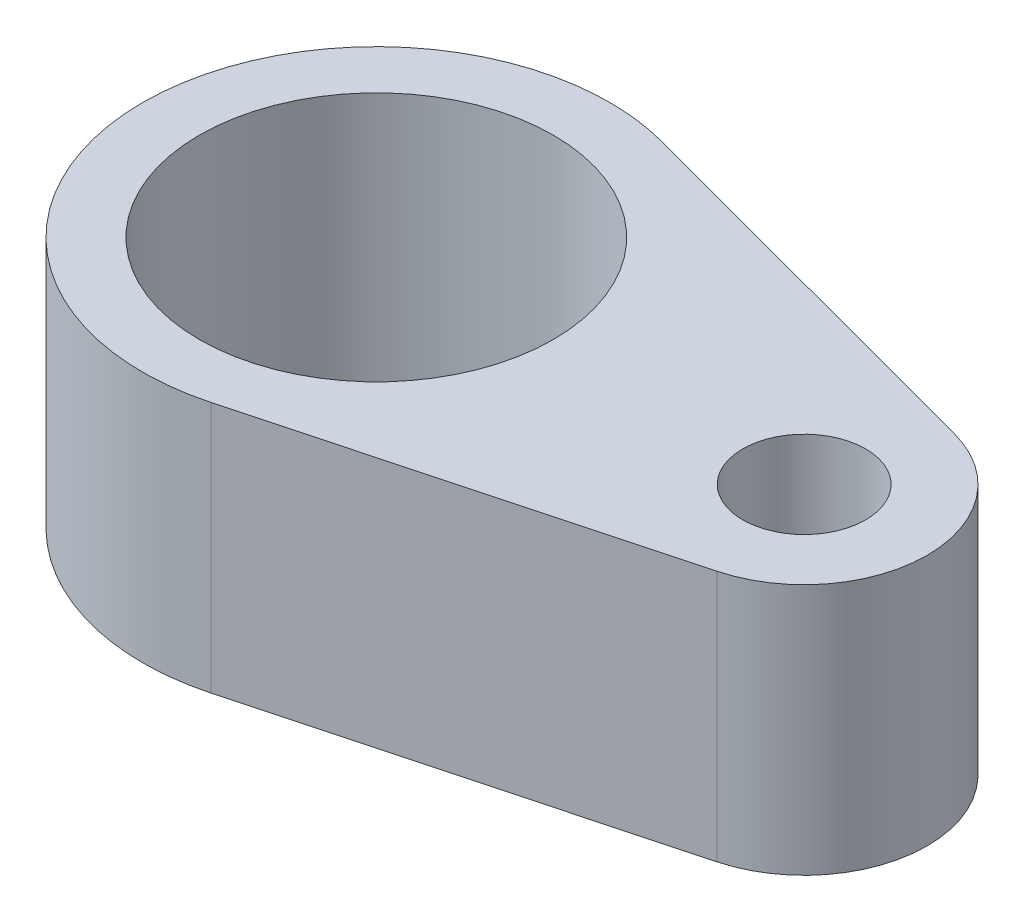
ISO-10303-21;
HEADER;
FILE_DESCRIPTION(('STEP AP214'),'2;1');
FILE_NAME('part.step','',(''),(''),'','','');
FILE_SCHEMA(('AUTOMOTIVE_DESIGN { 1 0 10303 214 1 1 1 1 }'));
ENDSEC;
DATA;
#1=APPLICATION_CONTEXT('core data for automotive mechanical design processes');
#2=APPLICATION_PROTOCOL_DEFINITION('international standard','automotive_design',2000,#1);
#3=PRODUCT_CONTEXT('',#1,'mechanical');
#4=PRODUCT('Part','Part','',(#3));
#5=PRODUCT_RELATED_PRODUCT_CATEGORY('part','',(#4));
#6=PRODUCT_DEFINITION_FORMATION('','',#4);
#7=PRODUCT_DEFINITION_CONTEXT('part definition',#1,'design');
#8=PRODUCT_DEFINITION('design','',#6,#7);
#9=PRODUCT_DEFINITION_SHAPE('','',#8);
#10=(LENGTH_UNIT() NAMED_UNIT(*) SI_UNIT(.MILLI.,.METRE.));
#11=(NAMED_UNIT(*) PLANE_ANGLE_UNIT() SI_UNIT($,.RADIAN.));
#12=(NAMED_UNIT(*) SI_UNIT($,.STERADIAN.) SOLID_ANGLE_UNIT());
#13=UNCERTAINTY_MEASURE_WITH_UNIT(LENGTH_MEASURE(1.E-05),#10,'distance_accuracy_value','');
#14=(GEOMETRIC_REPRESENTATION_CONTEXT(3) GLOBAL_UNCERTAINTY_ASSIGNED_CONTEXT((#13)) GLOBAL_UNIT_ASSIGNED_CONTEXT((#10,
#11,#12)) REPRESENTATION_CONTEXT('',''));
#15=CARTESIAN_POINT('',(0.,0.,0.));
#16=DIRECTION('',(0.,0.,1.));
#17=DIRECTION('',(1.,0.,0.));
#18=AXIS2_PLACEMENT_3D('',#15,#16,#17);
#19=CARTESIAN_POINT('',(0.,13.,0.));
#20=DIRECTION('',(0.,1.,0.));
#21=DIRECTION('',(0.,0.,1.));
#22=AXIS2_PLACEMENT_3D('',#19,#20,#21);
#23=PLANE('',#22);
#24=CARTESIAN_POINT('',(0.,13.,0.));
#25=DIRECTION('',(0.,1.,0.));
#26=DIRECTION('',(0.,0.,1.));
#27=AXIS2_PLACEMENT_3D('',#24,#25,#26);
#28=CIRCLE('',#27,9.144);
#29=CARTESIAN_POINT('',(0.,13.,-9.144));
#30=VERTEX_POINT('',#29);
#31=EDGE_CURVE('E120',#30,#30,#28,.T.);
#32=ORIENTED_EDGE('',*,*,#31,.F.);
#33=EDGE_LOOP('',(#32));
#34=FACE_BOUND('',#33,.T.);
#35=CARTESIAN_POINT('',(0.,13.,0.));
#36=DIRECTION('',(0.,1.,0.));
#37=DIRECTION('',(0.,0.,1.));
#38=AXIS2_PLACEMENT_3D('',#35,#36,#37);
#39=CIRCLE('',#38,12.065);
#40=CARTESIAN_POINT('',(3.12025862068966,13.,-11.6545360757094));
#41=VERTEX_POINT('',#40);
#42=CARTESIAN_POINT('',(3.12025862068965,13.,11.6545360757094));
#43=VERTEX_POINT('',#42);
#44=EDGE_CURVE('E100',#41,#43,#39,.T.);
#45=ORIENTED_EDGE('',*,*,#44,.T.);
#46=DIRECTION('',(0.965978953643547,0.,-0.258620689655172));
#47=VECTOR('',#46,1.);
#48=CARTESIAN_POINT('',(3.12025862068965,13.,11.6545360757094));
#49=LINE('',#48,#47);
#50=CARTESIAN_POINT('',(23.7402413793103,13.,6.13396635563653));
#51=VERTEX_POINT('',#50);
#52=EDGE_CURVE('E95',#43,#51,#49,.T.);
#53=ORIENTED_EDGE('',*,*,#52,.T.);
#54=CARTESIAN_POINT('',(22.098,13.,0.));
#55=DIRECTION('',(0.,1.,0.));
#56=DIRECTION('',(0.,0.,-1.));
#57=AXIS2_PLACEMENT_3D('',#54,#55,#56);
#58=CIRCLE('',#57,6.35);
#59=CARTESIAN_POINT('',(23.7402413793103,13.,-6.13396635563653));
#60=VERTEX_POINT('',#59);
#61=EDGE_CURVE('E98',#51,#60,#58,.T.);
#62=ORIENTED_EDGE('',*,*,#61,.T.);
#63=DIRECTION('',(-0.965978953643547,0.,-0.258620689655172));
#64=VECTOR('',#63,1.);
#65=CARTESIAN_POINT('',(3.12025862068966,13.,-11.6545360757094));
#66=LINE('',#65,#64);
#67=EDGE_CURVE('E65',#60,#41,#66,.T.);
#68=ORIENTED_EDGE('',*,*,#67,.T.);
#69=EDGE_LOOP('',(#45,#53,#62,#68));
#70=FACE_BOUND('',#69,.T.);
#71=CARTESIAN_POINT('',(22.098,13.,0.));
#72=DIRECTION('',(0.,1.,0.));
#73=DIRECTION('',(0.,0.,1.));
#74=AXIS2_PLACEMENT_3D('',#71,#72,#73);
#75=CIRCLE('',#74,3.175);
#76=CARTESIAN_POINT('',(22.098,13.,-3.175));
#77=VERTEX_POINT('',#76);
#78=EDGE_CURVE('E142',#77,#77,#75,.T.);
#79=ORIENTED_EDGE('',*,*,#78,.F.);
#80=EDGE_LOOP('',(#79));
#81=FACE_BOUND('',#80,.T.);
#82=ADVANCED_FACE('F47',(#34,#70,#81),#23,.T.);
#83=CARTESIAN_POINT('',(0.,0.,0.));
#84=DIRECTION('',(0.,1.,0.));
#85=DIRECTION('',(0.,0.,1.));
#86=AXIS2_PLACEMENT_3D('',#83,#84,#85);
#87=PLANE('',#86);
#88=CARTESIAN_POINT('',(0.,0.,0.));
#89=DIRECTION('',(0.,1.,0.));
#90=DIRECTION('',(0.,0.,1.));
#91=AXIS2_PLACEMENT_3D('',#88,#89,#90);
#92=CIRCLE('',#91,12.065);
#93=CARTESIAN_POINT('',(3.12025862068966,0.,-11.6545360757094));
#94=VERTEX_POINT('',#93);
#95=CARTESIAN_POINT('',(3.12025862068965,0.,11.6545360757094));
#96=VERTEX_POINT('',#95);
#97=EDGE_CURVE('E116',#94,#96,#92,.T.);
#98=ORIENTED_EDGE('',*,*,#97,.F.);
#99=DIRECTION('',(-0.965978953643547,0.,-0.258620689655172));
#100=VECTOR('',#99,1.);
#101=CARTESIAN_POINT('',(3.12025862068966,0.,-11.6545360757094));
#102=LINE('',#101,#100);
#103=CARTESIAN_POINT('',(23.7402413793103,0.,-6.13396635563653));
#104=VERTEX_POINT('',#103);
#105=EDGE_CURVE('E88',#104,#94,#102,.T.);
#106=ORIENTED_EDGE('',*,*,#105,.F.);
#107=CARTESIAN_POINT('',(22.098,0.,0.));
#108=DIRECTION('',(0.,1.,0.));
#109=DIRECTION('',(0.,0.,-1.));
#110=AXIS2_PLACEMENT_3D('',#107,#108,#109);
#111=CIRCLE('',#110,6.35);
#112=CARTESIAN_POINT('',(23.7402413793103,0.,6.13396635563653));
#113=VERTEX_POINT('',#112);
#114=EDGE_CURVE('E82',#113,#104,#111,.T.);
#115=ORIENTED_EDGE('',*,*,#114,.F.);
#116=DIRECTION('',(0.965978953643547,0.,-0.258620689655172));
#117=VECTOR('',#116,1.);
#118=CARTESIAN_POINT('',(3.12025862068965,0.,11.6545360757094));
#119=LINE('',#118,#117);
#120=EDGE_CURVE('E105',#96,#113,#119,.T.);
#121=ORIENTED_EDGE('',*,*,#120,.F.);
#122=EDGE_LOOP('',(#98,#106,#115,#121));
#123=FACE_BOUND('',#122,.T.);
#124=CARTESIAN_POINT('',(0.,0.,0.));
#125=DIRECTION('',(0.,1.,0.));
#126=DIRECTION('',(0.,0.,1.));
#127=AXIS2_PLACEMENT_3D('',#124,#125,#126);
#128=CIRCLE('',#127,9.144);
#129=CARTESIAN_POINT('',(0.,0.,-9.144));
#130=VERTEX_POINT('',#129);
#131=EDGE_CURVE('E138',#130,#130,#128,.T.);
#132=ORIENTED_EDGE('',*,*,#131,.T.);
#133=EDGE_LOOP('',(#132));
#134=FACE_BOUND('',#133,.T.);
#135=CARTESIAN_POINT('',(22.098,0.,0.));
#136=DIRECTION('',(0.,1.,0.));
#137=DIRECTION('',(0.,0.,1.));
#138=AXIS2_PLACEMENT_3D('',#135,#136,#137);
#139=CIRCLE('',#138,3.175);
#140=CARTESIAN_POINT('',(22.098,0.,-3.175));
#141=VERTEX_POINT('',#140);
#142=EDGE_CURVE('E146',#141,#141,#139,.T.);
#143=ORIENTED_EDGE('',*,*,#142,.T.);
#144=EDGE_LOOP('',(#143));
#145=FACE_BOUND('',#144,.T.);
#146=ADVANCED_FACE('F133',(#123,#134,#145),#87,.F.);
#147=CARTESIAN_POINT('',(0.,13.,0.));
#148=DIRECTION('',(0.,-1.,0.));
#149=DIRECTION('',(0.,0.,-1.));
#150=AXIS2_PLACEMENT_3D('',#147,#148,#149);
#151=CYLINDRICAL_SURFACE('',#150,12.065);
#152=ORIENTED_EDGE('',*,*,#97,.T.);
#153=DIRECTION('',(0.,-1.,0.));
#154=VECTOR('',#153,1.);
#155=CARTESIAN_POINT('',(3.12025862068965,13.,11.6545360757094));
#156=LINE('',#155,#154);
#157=EDGE_CURVE('E11',#43,#96,#156,.T.);
#158=ORIENTED_EDGE('',*,*,#157,.F.);
#159=ORIENTED_EDGE('',*,*,#44,.F.);
#160=DIRECTION('',(0.,-1.,0.));
#161=VECTOR('',#160,1.);
#162=CARTESIAN_POINT('',(3.12025862068966,13.,-11.6545360757094));
#163=LINE('',#162,#161);
#164=EDGE_CURVE('E112',#41,#94,#163,.T.);
#165=ORIENTED_EDGE('',*,*,#164,.T.);
#166=EDGE_LOOP('',(#152,#158,#159,#165));
#167=FACE_BOUND('',#166,.T.);
#168=ADVANCED_FACE('F49',(#167),#151,.T.);
#169=CARTESIAN_POINT('',(3.12025862068965,13.,11.6545360757094));
#170=DIRECTION('',(-0.258620689655172,0.,-0.965978953643547));
#171=DIRECTION('',(-0.965978953643548,0.,0.258620689655172));
#172=AXIS2_PLACEMENT_3D('',#169,#170,#171);
#173=PLANE('',#172);
#174=ORIENTED_EDGE('',*,*,#120,.T.);
#175=DIRECTION('',(0.,-1.,0.));
#176=VECTOR('',#175,1.);
#177=CARTESIAN_POINT('',(23.7402413793103,13.,6.13396635563653));
#178=LINE('',#177,#176);
#179=EDGE_CURVE('E57',#51,#113,#178,.T.);
#180=ORIENTED_EDGE('',*,*,#179,.F.);
#181=ORIENTED_EDGE('',*,*,#52,.F.);
#182=ORIENTED_EDGE('',*,*,#157,.T.);
#183=EDGE_LOOP('',(#174,#180,#181,#182));
#184=FACE_BOUND('',#183,.T.);
#185=ADVANCED_FACE('F104',(#184),#173,.F.);
#186=CARTESIAN_POINT('',(22.098,13.,0.));
#187=DIRECTION('',(0.,-1.,0.));
#188=DIRECTION('',(0.,0.,-1.));
#189=AXIS2_PLACEMENT_3D('',#186,#187,#188);
#190=CYLINDRICAL_SURFACE('',#189,6.35);
#191=ORIENTED_EDGE('',*,*,#114,.T.);
#192=DIRECTION('',(0.,-1.,0.));
#193=VECTOR('',#192,1.);
#194=CARTESIAN_POINT('',(23.7402413793103,13.,-6.13396635563653));
#195=LINE('',#194,#193);
#196=EDGE_CURVE('E107',#60,#104,#195,.T.);
#197=ORIENTED_EDGE('',*,*,#196,.F.);
#198=ORIENTED_EDGE('',*,*,#61,.F.);
#199=ORIENTED_EDGE('',*,*,#179,.T.);
#200=EDGE_LOOP('',(#191,#197,#198,#199));
#201=FACE_BOUND('',#200,.T.);
#202=ADVANCED_FACE('F108',(#201),#190,.T.);
#203=CARTESIAN_POINT('',(3.12025862068966,13.,-11.6545360757094));
#204=DIRECTION('',(-0.258620689655172,0.,0.965978953643547));
#205=DIRECTION('',(0.965978953643548,0.,0.258620689655172));
#206=AXIS2_PLACEMENT_3D('',#203,#204,#205);
#207=PLANE('',#206);
#208=ORIENTED_EDGE('',*,*,#105,.T.);
#209=ORIENTED_EDGE('',*,*,#164,.F.);
#210=ORIENTED_EDGE('',*,*,#67,.F.);
#211=ORIENTED_EDGE('',*,*,#196,.T.);
#212=EDGE_LOOP('',(#208,#209,#210,#211));
#213=FACE_BOUND('',#212,.T.);
#214=ADVANCED_FACE('F130',(#213),#207,.F.);
#215=CARTESIAN_POINT('',(0.,13.,0.));
#216=DIRECTION('',(0.,-1.,0.));
#217=DIRECTION('',(0.,0.,-1.));
#218=AXIS2_PLACEMENT_3D('',#215,#216,#217);
#219=CYLINDRICAL_SURFACE('',#218,9.144);
#220=CARTESIAN_POINT('',(0.,13.,-9.144));
#221=CARTESIAN_POINT('',(0.,12.8645833333333,-9.144));
#222=CARTESIAN_POINT('',(0.,12.7291666666667,-9.144));
#223=CARTESIAN_POINT('',(0.,12.4583333333333,-9.144));
#224=CARTESIAN_POINT('',(0.,12.3229166666667,-9.144));
#225=CARTESIAN_POINT('',(0.,12.0520833333333,-9.144));
#226=CARTESIAN_POINT('',(0.,11.9166666666667,-9.144));
#227=CARTESIAN_POINT('',(0.,11.6458333333333,-9.144));
#228=CARTESIAN_POINT('',(0.,11.5104166666667,-9.144));
#229=CARTESIAN_POINT('',(0.,11.2395833333333,-9.144));
#230=CARTESIAN_POINT('',(0.,11.1041666666667,-9.144));
#231=CARTESIAN_POINT('',(0.,10.8333333333333,-9.144));
#232=CARTESIAN_POINT('',(0.,10.6979166666667,-9.144));
#233=CARTESIAN_POINT('',(0.,10.4270833333333,-9.144));
#234=CARTESIAN_POINT('',(0.,10.2916666666667,-9.144));
#235=CARTESIAN_POINT('',(0.,10.0208333333333,-9.144));
#236=CARTESIAN_POINT('',(0.,9.88541666666667,-9.144));
#237=CARTESIAN_POINT('',(0.,9.61458333333333,-9.144));
#238=CARTESIAN_POINT('',(0.,9.47916666666667,-9.144));
#239=CARTESIAN_POINT('',(0.,9.20833333333333,-9.144));
#240=CARTESIAN_POINT('',(0.,9.07291666666666,-9.144));
#241=CARTESIAN_POINT('',(0.,8.80208333333333,-9.144));
#242=CARTESIAN_POINT('',(0.,8.66666666666667,-9.144));
#243=CARTESIAN_POINT('',(0.,8.39583333333333,-9.144));
#244=CARTESIAN_POINT('',(0.,8.26041666666667,-9.144));
#245=CARTESIAN_POINT('',(0.,7.98958333333333,-9.144));
#246=CARTESIAN_POINT('',(0.,7.85416666666667,-9.144));
#247=CARTESIAN_POINT('',(0.,7.58333333333333,-9.144));
#248=CARTESIAN_POINT('',(0.,7.44791666666667,-9.144));
#249=CARTESIAN_POINT('',(0.,7.17708333333333,-9.144));
#250=CARTESIAN_POINT('',(0.,7.04166666666667,-9.144));
#251=CARTESIAN_POINT('',(0.,6.77083333333333,-9.144));
#252=CARTESIAN_POINT('',(0.,6.63541666666667,-9.144));
#253=CARTESIAN_POINT('',(0.,6.36458333333333,-9.144));
#254=CARTESIAN_POINT('',(0.,6.22916666666667,-9.144));
#255=CARTESIAN_POINT('',(0.,5.95833333333333,-9.144));
#256=CARTESIAN_POINT('',(0.,5.82291666666667,-9.144));
#257=CARTESIAN_POINT('',(0.,5.55208333333333,-9.144));
#258=CARTESIAN_POINT('',(0.,5.41666666666667,-9.144));
#259=CARTESIAN_POINT('',(0.,5.14583333333333,-9.144));
#260=CARTESIAN_POINT('',(0.,5.01041666666667,-9.144));
#261=CARTESIAN_POINT('',(0.,4.73958333333333,-9.144));
#262=CARTESIAN_POINT('',(0.,4.60416666666667,-9.144));
#263=CARTESIAN_POINT('',(0.,4.33333333333333,-9.144));
#264=CARTESIAN_POINT('',(0.,4.19791666666667,-9.144));
#265=CARTESIAN_POINT('',(0.,3.92708333333333,-9.144));
#266=CARTESIAN_POINT('',(0.,3.79166666666667,-9.144));
#267=CARTESIAN_POINT('',(0.,3.52083333333333,-9.144));
#268=CARTESIAN_POINT('',(0.,3.38541666666667,-9.144));
#269=CARTESIAN_POINT('',(0.,3.11458333333333,-9.144));
#270=CARTESIAN_POINT('',(0.,2.97916666666667,-9.144));
#271=CARTESIAN_POINT('',(0.,2.70833333333333,-9.144));
#272=CARTESIAN_POINT('',(0.,2.57291666666667,-9.144));
#273=CARTESIAN_POINT('',(0.,2.30208333333333,-9.144));
#274=CARTESIAN_POINT('',(0.,2.16666666666667,-9.144));
#275=CARTESIAN_POINT('',(0.,1.89583333333333,-9.144));
#276=CARTESIAN_POINT('',(0.,1.76041666666667,-9.144));
#277=CARTESIAN_POINT('',(0.,1.48958333333333,-9.144));
#278=CARTESIAN_POINT('',(0.,1.35416666666667,-9.144));
#279=CARTESIAN_POINT('',(0.,1.08333333333333,-9.144));
#280=CARTESIAN_POINT('',(0.,0.947916666666667,-9.144));
#281=CARTESIAN_POINT('',(0.,0.677083333333334,-9.144));
#282=CARTESIAN_POINT('',(0.,0.541666666666667,-9.144));
#283=CARTESIAN_POINT('',(0.,0.270833333333334,-9.144));
#284=CARTESIAN_POINT('',(0.,0.135416666666667,-9.144));
#285=CARTESIAN_POINT('',(0.,0.,-9.144));
#286=B_SPLINE_CURVE_WITH_KNOTS('',3,(#220,#221,#222,#223,#224,#225,#226,#227,#228,#229,#230,
#231,#232,#233,#234,#235,#236,#237,#238,#239,#240,#241,#242,#243,#244,#245,#246,#247,#248,#249,
#250,#251,#252,#253,#254,#255,#256,#257,#258,#259,#260,#261,#262,#263,#264,#265,#266,#267,#268,
#269,#270,#271,#272,#273,#274,#275,#276,#277,#278,#279,#280,#281,#282,#283,#284,#285),
.UNSPECIFIED.,.F.,.F.,(4,2,2,2,2,2,2,2,2,2,2,2,2,2,2,2,2,2,2,2,2,2,2,2,2,2,2,2,2,2,2,2,4),(0.,
0.40625,0.812500000000001,1.21875,1.625,2.03125,2.4375,2.84375,3.25,3.65625,4.0625,4.46875,
4.875,5.28125,5.6875,6.09375,6.5,6.90625,7.3125,7.71875,8.125,8.53125,8.9375,9.34375,9.75,
10.15625,10.5625,10.96875,11.375,11.78125,12.1875,12.59375,13.),.UNSPECIFIED.);
#287=EDGE_CURVE('BSEAM165',#30,#130,#286,.T.);
#288=ORIENTED_EDGE('',*,*,#31,.T.);
#289=ORIENTED_EDGE('',*,*,#131,.F.);
#290=ORIENTED_EDGE('',*,*,#287,.T.);
#291=ORIENTED_EDGE('',*,*,#287,.F.);
#292=EDGE_LOOP('',(#288,#290,#289,#291));
#293=FACE_BOUND('',#292,.T.);
#294=ADVANCED_FACE('F165',(#293),#219,.F.);
#295=CARTESIAN_POINT('',(22.098,13.,0.));
#296=DIRECTION('',(0.,-1.,0.));
#297=DIRECTION('',(0.,0.,-1.));
#298=AXIS2_PLACEMENT_3D('',#295,#296,#297);
#299=CYLINDRICAL_SURFACE('',#298,3.175);
#300=CARTESIAN_POINT('',(22.098,13.,-3.175));
#301=CARTESIAN_POINT('',(22.098,12.8645833333333,-3.175));
#302=CARTESIAN_POINT('',(22.098,12.7291666666667,-3.175));
#303=CARTESIAN_POINT('',(22.098,12.4583333333333,-3.175));
#304=CARTESIAN_POINT('',(22.098,12.3229166666667,-3.175));
#305=CARTESIAN_POINT('',(22.098,12.0520833333333,-3.175));
#306=CARTESIAN_POINT('',(22.098,11.9166666666667,-3.175));
#307=CARTESIAN_POINT('',(22.098,11.6458333333333,-3.175));
#308=CARTESIAN_POINT('',(22.098,11.5104166666667,-3.175));
#309=CARTESIAN_POINT('',(22.098,11.2395833333333,-3.175));
#310=CARTESIAN_POINT('',(22.098,11.1041666666667,-3.175));
#311=CARTESIAN_POINT('',(22.098,10.8333333333333,-3.175));
#312=CARTESIAN_POINT('',(22.098,10.6979166666667,-3.175));
#313=CARTESIAN_POINT('',(22.098,10.4270833333333,-3.175));
#314=CARTESIAN_POINT('',(22.098,10.2916666666667,-3.175));
#315=CARTESIAN_POINT('',(22.098,10.0208333333333,-3.175));
#316=CARTESIAN_POINT('',(22.098,9.88541666666667,-3.175));
#317=CARTESIAN_POINT('',(22.098,9.61458333333333,-3.175));
#318=CARTESIAN_POINT('',(22.098,9.47916666666667,-3.175));
#319=CARTESIAN_POINT('',(22.098,9.20833333333333,-3.175));
#320=CARTESIAN_POINT('',(22.098,9.07291666666667,-3.175));
#321=CARTESIAN_POINT('',(22.098,8.80208333333333,-3.175));
#322=CARTESIAN_POINT('',(22.098,8.66666666666667,-3.175));
#323=CARTESIAN_POINT('',(22.098,8.39583333333333,-3.175));
#324=CARTESIAN_POINT('',(22.098,8.26041666666667,-3.175));
#325=CARTESIAN_POINT('',(22.098,7.98958333333333,-3.175));
#326=CARTESIAN_POINT('',(22.098,7.85416666666667,-3.175));
#327=CARTESIAN_POINT('',(22.098,7.58333333333333,-3.175));
#328=CARTESIAN_POINT('',(22.098,7.44791666666667,-3.175));
#329=CARTESIAN_POINT('',(22.098,7.17708333333333,-3.175));
#330=CARTESIAN_POINT('',(22.098,7.04166666666667,-3.175));
#331=CARTESIAN_POINT('',(22.098,6.77083333333333,-3.175));
#332=CARTESIAN_POINT('',(22.098,6.63541666666667,-3.175));
#333=CARTESIAN_POINT('',(22.098,6.36458333333333,-3.175));
#334=CARTESIAN_POINT('',(22.098,6.22916666666667,-3.175));
#335=CARTESIAN_POINT('',(22.098,5.95833333333333,-3.175));
#336=CARTESIAN_POINT('',(22.098,5.82291666666667,-3.175));
#337=CARTESIAN_POINT('',(22.098,5.55208333333333,-3.175));
#338=CARTESIAN_POINT('',(22.098,5.41666666666667,-3.175));
#339=CARTESIAN_POINT('',(22.098,5.14583333333333,-3.175));
#340=CARTESIAN_POINT('',(22.098,5.01041666666667,-3.175));
#341=CARTESIAN_POINT('',(22.098,4.73958333333333,-3.175));
#342=CARTESIAN_POINT('',(22.098,4.60416666666667,-3.175));
#343=CARTESIAN_POINT('',(22.098,4.33333333333333,-3.175));
#344=CARTESIAN_POINT('',(22.098,4.19791666666667,-3.175));
#345=CARTESIAN_POINT('',(22.098,3.92708333333333,-3.175));
#346=CARTESIAN_POINT('',(22.098,3.79166666666667,-3.175));
#347=CARTESIAN_POINT('',(22.098,3.52083333333333,-3.175));
#348=CARTESIAN_POINT('',(22.098,3.38541666666667,-3.175));
#349=CARTESIAN_POINT('',(22.098,3.11458333333333,-3.175));
#350=CARTESIAN_POINT('',(22.098,2.97916666666667,-3.175));
#351=CARTESIAN_POINT('',(22.098,2.70833333333333,-3.175));
#352=CARTESIAN_POINT('',(22.098,2.57291666666667,-3.175));
#353=CARTESIAN_POINT('',(22.098,2.30208333333333,-3.175));
#354=CARTESIAN_POINT('',(22.098,2.16666666666667,-3.175));
#355=CARTESIAN_POINT('',(22.098,1.89583333333333,-3.175));
#356=CARTESIAN_POINT('',(22.098,1.76041666666667,-3.175));
#357=CARTESIAN_POINT('',(22.098,1.48958333333333,-3.175));
#358=CARTESIAN_POINT('',(22.098,1.35416666666667,-3.175));
#359=CARTESIAN_POINT('',(22.098,1.08333333333333,-3.175));
#360=CARTESIAN_POINT('',(22.098,0.947916666666667,-3.175));
#361=CARTESIAN_POINT('',(22.098,0.677083333333334,-3.175));
#362=CARTESIAN_POINT('',(22.098,0.541666666666667,-3.175));
#363=CARTESIAN_POINT('',(22.098,0.270833333333334,-3.175));
#364=CARTESIAN_POINT('',(22.098,0.135416666666667,-3.175));
#365=CARTESIAN_POINT('',(22.098,0.,-3.175));
#366=B_SPLINE_CURVE_WITH_KNOTS('',3,(#300,#301,#302,#303,#304,#305,#306,#307,#308,#309,#310,
#311,#312,#313,#314,#315,#316,#317,#318,#319,#320,#321,#322,#323,#324,#325,#326,#327,#328,#329,
#330,#331,#332,#333,#334,#335,#336,#337,#338,#339,#340,#341,#342,#343,#344,#345,#346,#347,#348,
#349,#350,#351,#352,#353,#354,#355,#356,#357,#358,#359,#360,#361,#362,#363,#364,#365),
.UNSPECIFIED.,.F.,.F.,(4,2,2,2,2,2,2,2,2,2,2,2,2,2,2,2,2,2,2,2,2,2,2,2,2,2,2,2,2,2,2,2,4),(0.,
0.406249999999999,0.812499999999999,1.21875,1.625,2.03125,2.4375,2.84375,3.25,3.65625,4.0625,
4.46875,4.875,5.28125,5.6875,6.09375,6.5,6.90625,7.3125,7.71875,8.125,8.53125,8.9375,9.34375,
9.75,10.15625,10.5625,10.96875,11.375,11.78125,12.1875,12.59375,13.),.UNSPECIFIED.);
#367=EDGE_CURVE('BSEAM154',#77,#141,#366,.T.);
#368=ORIENTED_EDGE('',*,*,#78,.T.);
#369=ORIENTED_EDGE('',*,*,#142,.F.);
#370=ORIENTED_EDGE('',*,*,#367,.T.);
#371=ORIENTED_EDGE('',*,*,#367,.F.);
#372=EDGE_LOOP('',(#368,#370,#369,#371));
#373=FACE_BOUND('',#372,.T.);
#374=ADVANCED_FACE('F154',(#373),#299,.F.);
#375=CLOSED_SHELL('',(#82,#146,#168,#185,#202,#214,#294,#374));
#376=MANIFOLD_SOLID_BREP('B2',#375);
#377=ADVANCED_BREP_SHAPE_REPRESENTATION('',(#18,#376),#14);
#378=SHAPE_DEFINITION_REPRESENTATION(#9,#377);
ENDSEC;
END-ISO-10303-21;
